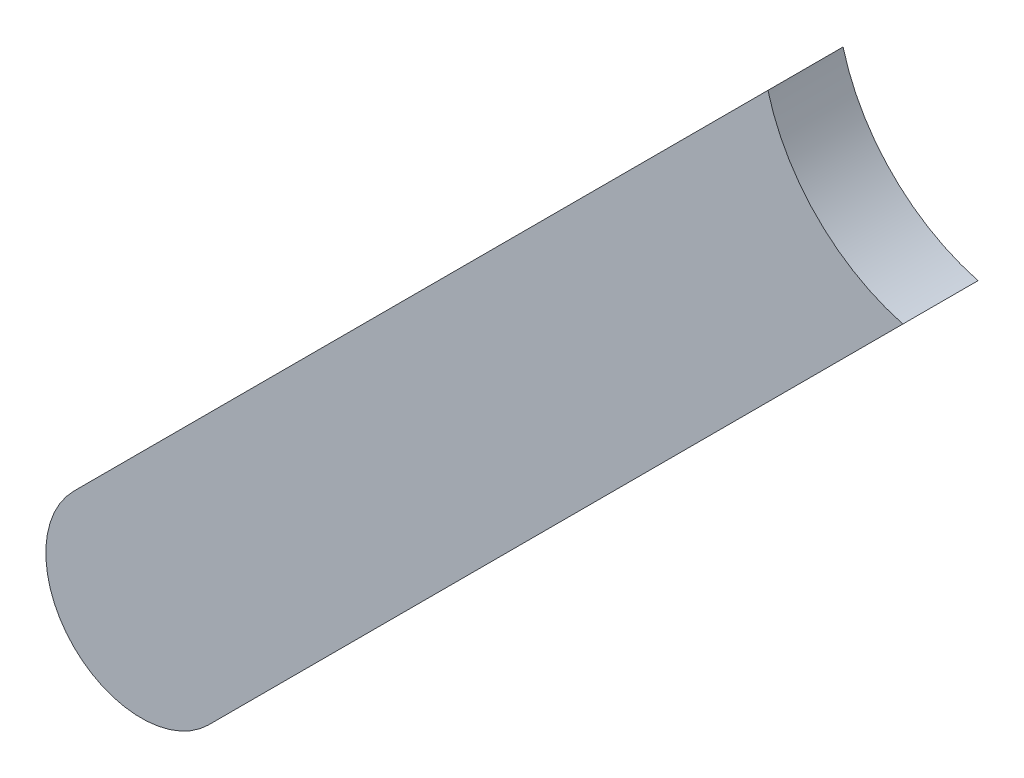
ISO-10303-21;
HEADER;
FILE_DESCRIPTION(('STEP AP214'),'2;1');
FILE_NAME('part.step','',(''),(''),'','','');
FILE_SCHEMA(('AUTOMOTIVE_DESIGN { 1 0 10303 214 1 1 1 1 }'));
ENDSEC;
DATA;
#1=APPLICATION_CONTEXT('core data for automotive mechanical design processes');
#2=APPLICATION_PROTOCOL_DEFINITION('international standard','automotive_design',2000,#1);
#3=PRODUCT_CONTEXT('',#1,'mechanical');
#4=PRODUCT('Part','Part','',(#3));
#5=PRODUCT_RELATED_PRODUCT_CATEGORY('part','',(#4));
#6=PRODUCT_DEFINITION_FORMATION('','',#4);
#7=PRODUCT_DEFINITION_CONTEXT('part definition',#1,'design');
#8=PRODUCT_DEFINITION('design','',#6,#7);
#9=PRODUCT_DEFINITION_SHAPE('','',#8);
#10=(LENGTH_UNIT() NAMED_UNIT(*) SI_UNIT(.MILLI.,.METRE.));
#11=(NAMED_UNIT(*) PLANE_ANGLE_UNIT() SI_UNIT($,.RADIAN.));
#12=(NAMED_UNIT(*) SI_UNIT($,.STERADIAN.) SOLID_ANGLE_UNIT());
#13=UNCERTAINTY_MEASURE_WITH_UNIT(LENGTH_MEASURE(1.E-05),#10,'distance_accuracy_value','');
#14=(GEOMETRIC_REPRESENTATION_CONTEXT(3) GLOBAL_UNCERTAINTY_ASSIGNED_CONTEXT((#13)) GLOBAL_UNIT_ASSIGNED_CONTEXT((#10,
#11,#12)) REPRESENTATION_CONTEXT('',''));
#15=CARTESIAN_POINT('',(0.,0.,0.));
#16=DIRECTION('',(0.,0.,1.));
#17=DIRECTION('',(1.,0.,0.));
#18=AXIS2_PLACEMENT_3D('',#15,#16,#17);
#19=CARTESIAN_POINT('',(150.80160594,105.48439406,0.));
#20=DIRECTION('',(-0.70710678118655,0.707106781186545,0.));
#21=DIRECTION('',(0.707106781186545,0.70710678118655,0.));
#22=AXIS2_PLACEMENT_3D('',#19,#20,#21);
#23=PLANE('',#22);
#24=DIRECTION('',(0.707106781186545,0.70710678118655,0.));
#25=VECTOR('',#24,1.);
#26=CARTESIAN_POINT('',(150.80160594,105.48439406,0.1999996));
#27=LINE('',#26,#25);
#28=CARTESIAN_POINT('',(150.80160594,105.48439406,0.1999996));
#29=VERTEX_POINT('',#28);
#30=CARTESIAN_POINT('',(152.649521214697,107.332309334697,0.1999996));
#31=VERTEX_POINT('',#30);
#32=EDGE_CURVE('E11',#29,#31,#27,.T.);
#33=ORIENTED_EDGE('',*,*,#32,.F.);
#34=DIRECTION('',(0.,0.,1.));
#35=VECTOR('',#34,1.);
#36=CARTESIAN_POINT('',(150.80160594,105.48439406,0.));
#37=LINE('',#36,#35);
#38=CARTESIAN_POINT('',(150.80160594,105.48439406,0.));
#39=VERTEX_POINT('',#38);
#40=EDGE_CURVE('E24',#39,#29,#37,.T.);
#41=ORIENTED_EDGE('',*,*,#40,.F.);
#42=DIRECTION('',(0.707106781186545,0.70710678118655,0.));
#43=VECTOR('',#42,1.);
#44=CARTESIAN_POINT('',(150.80160594,105.48439406,0.));
#45=LINE('',#44,#43);
#46=CARTESIAN_POINT('',(152.649521214697,107.332309334697,0.));
#47=VERTEX_POINT('',#46);
#48=EDGE_CURVE('E75',#39,#47,#45,.T.);
#49=ORIENTED_EDGE('',*,*,#48,.T.);
#50=DIRECTION('',(0.,0.,1.));
#51=VECTOR('',#50,1.);
#52=CARTESIAN_POINT('',(152.649521214697,107.332309334697,0.));
#53=LINE('',#52,#51);
#54=EDGE_CURVE('E37',#47,#31,#53,.T.);
#55=ORIENTED_EDGE('',*,*,#54,.T.);
#56=EDGE_LOOP('',(#33,#41,#49,#55));
#57=FACE_BOUND('',#56,.T.);
#58=ADVANCED_FACE('F17',(#57),#23,.F.);
#59=CARTESIAN_POINT('',(152.781,107.823,0.));
#60=DIRECTION('',(0.,0.,-1.));
#61=DIRECTION('',(1.,0.,0.));
#62=AXIS2_PLACEMENT_3D('',#59,#60,#61);
#63=CYLINDRICAL_SURFACE('',#62,0.508);
#64=DIRECTION('',(0.,0.,1.));
#65=VECTOR('',#64,1.);
#66=CARTESIAN_POINT('',(152.290309334697,107.691521214697,0.));
#67=LINE('',#66,#65);
#68=CARTESIAN_POINT('',(152.290309334697,107.691521214697,0.));
#69=VERTEX_POINT('',#68);
#70=CARTESIAN_POINT('',(152.290309334697,107.691521214697,0.1999996));
#71=VERTEX_POINT('',#70);
#72=EDGE_CURVE('E67',#69,#71,#67,.T.);
#73=ORIENTED_EDGE('',*,*,#72,.T.);
#74=CARTESIAN_POINT('',(152.781,107.823,0.1999996));
#75=DIRECTION('',(0.,0.,1.));
#76=DIRECTION('',(1.,0.,0.));
#77=AXIS2_PLACEMENT_3D('',#74,#75,#76);
#78=CIRCLE('',#77,0.508);
#79=EDGE_CURVE('E82',#71,#31,#78,.T.);
#80=ORIENTED_EDGE('',*,*,#79,.T.);
#81=ORIENTED_EDGE('',*,*,#54,.F.);
#82=CARTESIAN_POINT('',(152.781,107.823,0.));
#83=DIRECTION('',(0.,0.,1.));
#84=DIRECTION('',(1.,0.,0.));
#85=AXIS2_PLACEMENT_3D('',#82,#83,#84);
#86=CIRCLE('',#85,0.508);
#87=EDGE_CURVE('E80',#69,#47,#86,.T.);
#88=ORIENTED_EDGE('',*,*,#87,.F.);
#89=EDGE_LOOP('',(#73,#80,#81,#88));
#90=FACE_BOUND('',#89,.T.);
#91=ADVANCED_FACE('F88',(#90),#63,.F.);
#92=CARTESIAN_POINT('',(152.290309334697,107.691521214697,0.));
#93=DIRECTION('',(0.70710678118655,-0.707106781186545,0.));
#94=DIRECTION('',(-0.707106781186545,-0.70710678118655,0.));
#95=AXIS2_PLACEMENT_3D('',#92,#93,#94);
#96=PLANE('',#95);
#97=DIRECTION('',(-0.707106781186545,-0.70710678118655,0.));
#98=VECTOR('',#97,1.);
#99=CARTESIAN_POINT('',(152.60139406,108.00260594,0.1999996));
#100=LINE('',#99,#98);
#101=CARTESIAN_POINT('',(150.44239406,105.84360594,0.1999996));
#102=VERTEX_POINT('',#101);
#103=EDGE_CURVE('E71',#71,#102,#100,.T.);
#104=ORIENTED_EDGE('',*,*,#103,.F.);
#105=ORIENTED_EDGE('',*,*,#72,.F.);
#106=DIRECTION('',(-0.707106781186545,-0.70710678118655,0.));
#107=VECTOR('',#106,1.);
#108=CARTESIAN_POINT('',(152.60139406,108.00260594,0.));
#109=LINE('',#108,#107);
#110=CARTESIAN_POINT('',(150.44239406,105.84360594,0.));
#111=VERTEX_POINT('',#110);
#112=EDGE_CURVE('E63',#69,#111,#109,.T.);
#113=ORIENTED_EDGE('',*,*,#112,.T.);
#114=DIRECTION('',(0.,0.,1.));
#115=VECTOR('',#114,1.);
#116=CARTESIAN_POINT('',(150.44239406,105.84360594,0.));
#117=LINE('',#116,#115);
#118=EDGE_CURVE('E53',#111,#102,#117,.T.);
#119=ORIENTED_EDGE('',*,*,#118,.T.);
#120=EDGE_LOOP('',(#104,#105,#113,#119));
#121=FACE_BOUND('',#120,.T.);
#122=ADVANCED_FACE('F66',(#121),#96,.F.);
#123=CARTESIAN_POINT('',(150.622,105.664,0.));
#124=DIRECTION('',(0.,0.,-1.));
#125=DIRECTION('',(-0.707106781186576,0.70710678118652,0.));
#126=AXIS2_PLACEMENT_3D('',#123,#124,#125);
#127=CYLINDRICAL_SURFACE('',#126,0.254001156230774);
#128=CARTESIAN_POINT('',(150.622,105.664,0.1999996));
#129=DIRECTION('',(0.,0.,1.));
#130=DIRECTION('',(-0.707106781186576,0.70710678118652,0.));
#131=AXIS2_PLACEMENT_3D('',#128,#129,#130);
#132=CIRCLE('',#131,0.254001156230774);
#133=EDGE_CURVE('E59',#102,#29,#132,.T.);
#134=ORIENTED_EDGE('',*,*,#133,.F.);
#135=ORIENTED_EDGE('',*,*,#118,.F.);
#136=CARTESIAN_POINT('',(150.622,105.664,0.));
#137=DIRECTION('',(0.,0.,1.));
#138=DIRECTION('',(-0.707106781186576,0.70710678118652,0.));
#139=AXIS2_PLACEMENT_3D('',#136,#137,#138);
#140=CIRCLE('',#139,0.254001156230774);
#141=EDGE_CURVE('E57',#111,#39,#140,.T.);
#142=ORIENTED_EDGE('',*,*,#141,.T.);
#143=ORIENTED_EDGE('',*,*,#40,.T.);
#144=EDGE_LOOP('',(#134,#135,#142,#143));
#145=FACE_BOUND('',#144,.T.);
#146=ADVANCED_FACE('F55',(#145),#127,.T.);
#147=CARTESIAN_POINT('',(150.80160594,105.48439406,0.));
#148=DIRECTION('',(0.,0.,-1.));
#149=DIRECTION('',(-1.,0.,0.));
#150=AXIS2_PLACEMENT_3D('',#147,#148,#149);
#151=PLANE('',#150);
#152=ORIENTED_EDGE('',*,*,#48,.F.);
#153=ORIENTED_EDGE('',*,*,#141,.F.);
#154=ORIENTED_EDGE('',*,*,#112,.F.);
#155=ORIENTED_EDGE('',*,*,#87,.T.);
#156=EDGE_LOOP('',(#152,#153,#154,#155));
#157=FACE_BOUND('',#156,.T.);
#158=ADVANCED_FACE('F74',(#157),#151,.T.);
#159=CARTESIAN_POINT('',(150.80160594,105.48439406,0.1999996));
#160=DIRECTION('',(0.,0.,-1.));
#161=DIRECTION('',(-1.,0.,0.));
#162=AXIS2_PLACEMENT_3D('',#159,#160,#161);
#163=PLANE('',#162);
#164=ORIENTED_EDGE('',*,*,#133,.T.);
#165=ORIENTED_EDGE('',*,*,#32,.T.);
#166=ORIENTED_EDGE('',*,*,#79,.F.);
#167=ORIENTED_EDGE('',*,*,#103,.T.);
#168=EDGE_LOOP('',(#164,#165,#166,#167));
#169=FACE_BOUND('',#168,.T.);
#170=ADVANCED_FACE('F91',(#169),#163,.F.);
#171=CLOSED_SHELL('',(#58,#91,#122,#146,#158,#170));
#172=MANIFOLD_SOLID_BREP('B1',#171);
#173=ADVANCED_BREP_SHAPE_REPRESENTATION('',(#18,#172),#14);
#174=SHAPE_DEFINITION_REPRESENTATION(#9,#173);
ENDSEC;
END-ISO-10303-21;
